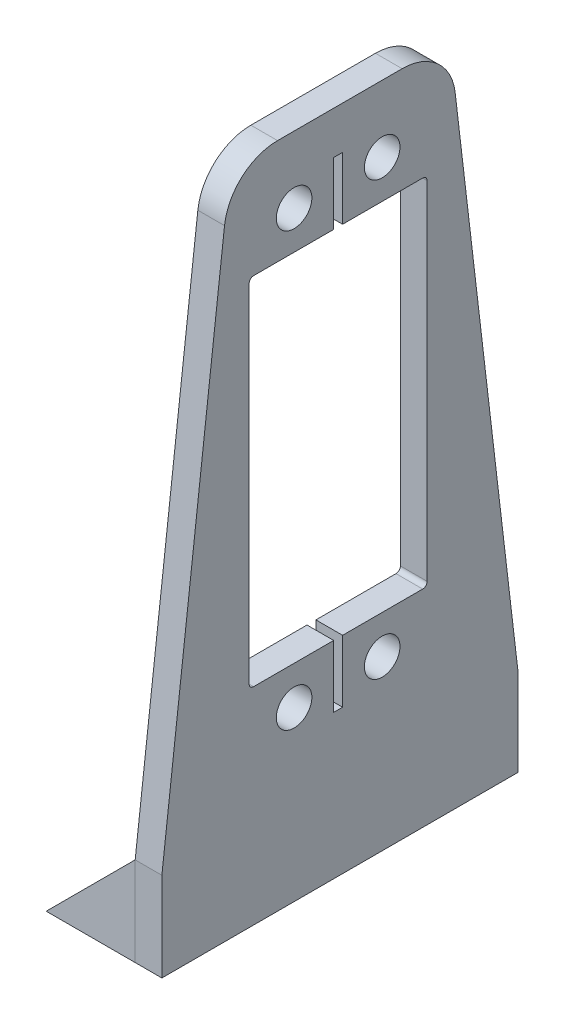
ISO-10303-21;
HEADER;
FILE_DESCRIPTION(('STEP AP214'),'2;1');
FILE_NAME('part.step','',(''),(''),'','','');
FILE_SCHEMA(('AUTOMOTIVE_DESIGN { 1 0 10303 214 1 1 1 1 }'));
ENDSEC;
DATA;
#1=APPLICATION_CONTEXT('core data for automotive mechanical design processes');
#2=APPLICATION_PROTOCOL_DEFINITION('international standard','automotive_design',2000,#1);
#3=PRODUCT_CONTEXT('',#1,'mechanical');
#4=PRODUCT('Part','Part','',(#3));
#5=PRODUCT_RELATED_PRODUCT_CATEGORY('part','',(#4));
#6=PRODUCT_DEFINITION_FORMATION('','',#4);
#7=PRODUCT_DEFINITION_CONTEXT('part definition',#1,'design');
#8=PRODUCT_DEFINITION('design','',#6,#7);
#9=PRODUCT_DEFINITION_SHAPE('','',#8);
#10=(LENGTH_UNIT() NAMED_UNIT(*) SI_UNIT(.MILLI.,.METRE.));
#11=(NAMED_UNIT(*) PLANE_ANGLE_UNIT() SI_UNIT($,.RADIAN.));
#12=(NAMED_UNIT(*) SI_UNIT($,.STERADIAN.) SOLID_ANGLE_UNIT());
#13=UNCERTAINTY_MEASURE_WITH_UNIT(LENGTH_MEASURE(1.E-05),#10,'distance_accuracy_value','');
#14=(GEOMETRIC_REPRESENTATION_CONTEXT(3) GLOBAL_UNCERTAINTY_ASSIGNED_CONTEXT((#13)) GLOBAL_UNIT_ASSIGNED_CONTEXT((#10,
#11,#12)) REPRESENTATION_CONTEXT('',''));
#15=CARTESIAN_POINT('',(0.,0.,0.));
#16=DIRECTION('',(0.,0.,1.));
#17=DIRECTION('',(1.,0.,0.));
#18=AXIS2_PLACEMENT_3D('',#15,#16,#17);
#19=CARTESIAN_POINT('',(23.,0.,-20.));
#20=DIRECTION('',(0.,1.,0.));
#21=DIRECTION('',(0.,0.,-1.));
#22=AXIS2_PLACEMENT_3D('',#19,#20,#21);
#23=PLANE('',#22);
#24=DIRECTION('',(0.,0.,1.));
#25=VECTOR('',#24,1.);
#26=CARTESIAN_POINT('',(20.,0.,-20.));
#27=LINE('',#26,#25);
#28=CARTESIAN_POINT('',(20.,0.,-20.));
#29=VERTEX_POINT('',#28);
#30=CARTESIAN_POINT('',(20.,0.,20.));
#31=VERTEX_POINT('',#30);
#32=EDGE_CURVE('E297',#29,#31,#27,.T.);
#33=ORIENTED_EDGE('',*,*,#32,.F.);
#34=DIRECTION('',(-1.,0.,0.));
#35=VECTOR('',#34,1.);
#36=CARTESIAN_POINT('',(23.,0.,-20.));
#37=LINE('',#36,#35);
#38=CARTESIAN_POINT('',(23.,0.,-20.));
#39=VERTEX_POINT('',#38);
#40=EDGE_CURVE('E322',#39,#29,#37,.T.);
#41=ORIENTED_EDGE('',*,*,#40,.F.);
#42=DIRECTION('',(0.,0.,1.));
#43=VECTOR('',#42,1.);
#44=CARTESIAN_POINT('',(23.,0.,-20.));
#45=LINE('',#44,#43);
#46=CARTESIAN_POINT('',(23.,0.,20.));
#47=VERTEX_POINT('',#46);
#48=EDGE_CURVE('E298',#39,#47,#45,.T.);
#49=ORIENTED_EDGE('',*,*,#48,.T.);
#50=DIRECTION('',(-1.,0.,0.));
#51=VECTOR('',#50,1.);
#52=CARTESIAN_POINT('',(23.,0.,20.));
#53=LINE('',#52,#51);
#54=EDGE_CURVE('E12',#47,#31,#53,.T.);
#55=ORIENTED_EDGE('',*,*,#54,.T.);
#56=EDGE_LOOP('',(#33,#41,#49,#55));
#57=FACE_BOUND('',#56,.T.);
#58=ADVANCED_FACE('F49',(#57),#23,.F.);
#59=CARTESIAN_POINT('',(23.,0.,20.));
#60=DIRECTION('',(0.,0.,-1.));
#61=DIRECTION('',(1.,0.,0.));
#62=AXIS2_PLACEMENT_3D('',#59,#60,#61);
#63=PLANE('',#62);
#64=DIRECTION('',(0.,1.,0.));
#65=VECTOR('',#64,1.);
#66=CARTESIAN_POINT('',(20.,0.,20.));
#67=LINE('',#66,#65);
#68=CARTESIAN_POINT('',(20.,10.,20.));
#69=VERTEX_POINT('',#68);
#70=EDGE_CURVE('E325',#31,#69,#67,.T.);
#71=ORIENTED_EDGE('',*,*,#70,.F.);
#72=ORIENTED_EDGE('',*,*,#54,.F.);
#73=DIRECTION('',(0.,1.,0.));
#74=VECTOR('',#73,1.);
#75=CARTESIAN_POINT('',(23.,0.,20.));
#76=LINE('',#75,#74);
#77=CARTESIAN_POINT('',(23.,10.,20.));
#78=VERTEX_POINT('',#77);
#79=EDGE_CURVE('E301',#47,#78,#76,.T.);
#80=ORIENTED_EDGE('',*,*,#79,.T.);
#81=DIRECTION('',(-1.,0.,0.));
#82=VECTOR('',#81,1.);
#83=CARTESIAN_POINT('',(23.,10.,20.));
#84=LINE('',#83,#82);
#85=EDGE_CURVE('E56',#78,#69,#84,.T.);
#86=ORIENTED_EDGE('',*,*,#85,.T.);
#87=EDGE_LOOP('',(#71,#72,#80,#86));
#88=FACE_BOUND('',#87,.T.);
#89=ADVANCED_FACE('F363',(#88),#63,.F.);
#90=CARTESIAN_POINT('',(23.,10.,20.));
#91=DIRECTION('',(0.,-0.117127450682147,-0.993116891557435));
#92=DIRECTION('',(0.,-0.993116891557435,0.117127450682147));
#93=AXIS2_PLACEMENT_3D('',#90,#91,#92);
#94=PLANE('',#93);
#95=DIRECTION('',(0.,0.993116891557435,-0.117127450682147));
#96=VECTOR('',#95,1.);
#97=CARTESIAN_POINT('',(20.,10.,20.));
#98=LINE('',#97,#96);
#99=CARTESIAN_POINT('',(20.,69.7027647040929,12.9587013493446));
#100=VERTEX_POINT('',#99);
#101=EDGE_CURVE('E328',#69,#100,#98,.T.);
#102=ORIENTED_EDGE('',*,*,#101,.F.);
#103=ORIENTED_EDGE('',*,*,#85,.F.);
#104=DIRECTION('',(0.,0.993116891557435,-0.117127450682147));
#105=VECTOR('',#104,1.);
#106=CARTESIAN_POINT('',(23.,10.,20.));
#107=LINE('',#106,#105);
#108=CARTESIAN_POINT('',(23.,69.7027647040929,12.9587013493446));
#109=VERTEX_POINT('',#108);
#110=EDGE_CURVE('E305',#78,#109,#107,.T.);
#111=ORIENTED_EDGE('',*,*,#110,.T.);
#112=DIRECTION('',(-1.,0.,0.));
#113=VECTOR('',#112,1.);
#114=CARTESIAN_POINT('',(23.,69.7027647040929,12.9587013493446));
#115=LINE('',#114,#113);
#116=EDGE_CURVE('E358',#109,#100,#115,.T.);
#117=ORIENTED_EDGE('',*,*,#116,.T.);
#118=EDGE_LOOP('',(#102,#103,#111,#117));
#119=FACE_BOUND('',#118,.T.);
#120=ADVANCED_FACE('F375',(#119),#94,.F.);
#121=CARTESIAN_POINT('',(23.,69.,7.));
#122=DIRECTION('',(-1.,0.,0.));
#123=DIRECTION('',(0.,0.,-1.));
#124=AXIS2_PLACEMENT_3D('',#121,#122,#123);
#125=CYLINDRICAL_SURFACE('',#124,6.);
#126=CARTESIAN_POINT('',(20.,69.,7.));
#127=DIRECTION('',(-1.,0.,0.));
#128=DIRECTION('',(0.,0.,1.));
#129=AXIS2_PLACEMENT_3D('',#126,#127,#128);
#130=CIRCLE('',#129,6.);
#131=CARTESIAN_POINT('',(20.,75.,7.));
#132=VERTEX_POINT('',#131);
#133=EDGE_CURVE('E331',#100,#132,#130,.T.);
#134=ORIENTED_EDGE('',*,*,#133,.F.);
#135=ORIENTED_EDGE('',*,*,#116,.F.);
#136=CARTESIAN_POINT('',(23.,69.,7.));
#137=DIRECTION('',(-1.,0.,0.));
#138=DIRECTION('',(0.,0.,1.));
#139=AXIS2_PLACEMENT_3D('',#136,#137,#138);
#140=CIRCLE('',#139,6.);
#141=CARTESIAN_POINT('',(23.,75.,7.));
#142=VERTEX_POINT('',#141);
#143=EDGE_CURVE('E308',#109,#142,#140,.T.);
#144=ORIENTED_EDGE('',*,*,#143,.T.);
#145=DIRECTION('',(-1.,0.,0.));
#146=VECTOR('',#145,1.);
#147=CARTESIAN_POINT('',(23.,75.,7.));
#148=LINE('',#147,#146);
#149=EDGE_CURVE('E355',#142,#132,#148,.T.);
#150=ORIENTED_EDGE('',*,*,#149,.T.);
#151=EDGE_LOOP('',(#134,#135,#144,#150));
#152=FACE_BOUND('',#151,.T.);
#153=ADVANCED_FACE('F377',(#152),#125,.T.);
#154=CARTESIAN_POINT('',(23.,75.,7.));
#155=DIRECTION('',(0.,-1.,0.));
#156=DIRECTION('',(0.,0.,1.));
#157=AXIS2_PLACEMENT_3D('',#154,#155,#156);
#158=PLANE('',#157);
#159=DIRECTION('',(0.,0.,-1.));
#160=VECTOR('',#159,1.);
#161=CARTESIAN_POINT('',(20.,75.,7.));
#162=LINE('',#161,#160);
#163=CARTESIAN_POINT('',(20.,75.,-7.));
#164=VERTEX_POINT('',#163);
#165=EDGE_CURVE('E334',#132,#164,#162,.T.);
#166=ORIENTED_EDGE('',*,*,#165,.F.);
#167=ORIENTED_EDGE('',*,*,#149,.F.);
#168=DIRECTION('',(0.,0.,-1.));
#169=VECTOR('',#168,1.);
#170=CARTESIAN_POINT('',(23.,75.,7.));
#171=LINE('',#170,#169);
#172=CARTESIAN_POINT('',(23.,75.,-7.));
#173=VERTEX_POINT('',#172);
#174=EDGE_CURVE('E311',#142,#173,#171,.T.);
#175=ORIENTED_EDGE('',*,*,#174,.T.);
#176=DIRECTION('',(-1.,0.,0.));
#177=VECTOR('',#176,1.);
#178=CARTESIAN_POINT('',(23.,75.,-7.));
#179=LINE('',#178,#177);
#180=EDGE_CURVE('E352',#173,#164,#179,.T.);
#181=ORIENTED_EDGE('',*,*,#180,.T.);
#182=EDGE_LOOP('',(#166,#167,#175,#181));
#183=FACE_BOUND('',#182,.T.);
#184=ADVANCED_FACE('F380',(#183),#158,.F.);
#185=CARTESIAN_POINT('',(23.,69.,-7.));
#186=DIRECTION('',(-1.,0.,0.));
#187=DIRECTION('',(0.,0.,-1.));
#188=AXIS2_PLACEMENT_3D('',#185,#186,#187);
#189=CYLINDRICAL_SURFACE('',#188,6.);
#190=CARTESIAN_POINT('',(20.,69.,-7.));
#191=DIRECTION('',(-1.,0.,0.));
#192=DIRECTION('',(0.,0.,-1.));
#193=AXIS2_PLACEMENT_3D('',#190,#191,#192);
#194=CIRCLE('',#193,6.);
#195=CARTESIAN_POINT('',(20.,69.7027647040929,-12.9587013493446));
#196=VERTEX_POINT('',#195);
#197=EDGE_CURVE('E337',#164,#196,#194,.T.);
#198=ORIENTED_EDGE('',*,*,#197,.F.);
#199=ORIENTED_EDGE('',*,*,#180,.F.);
#200=CARTESIAN_POINT('',(23.,69.,-7.));
#201=DIRECTION('',(-1.,0.,0.));
#202=DIRECTION('',(0.,0.,-1.));
#203=AXIS2_PLACEMENT_3D('',#200,#201,#202);
#204=CIRCLE('',#203,6.);
#205=CARTESIAN_POINT('',(23.,69.7027647040929,-12.9587013493446));
#206=VERTEX_POINT('',#205);
#207=EDGE_CURVE('E314',#173,#206,#204,.T.);
#208=ORIENTED_EDGE('',*,*,#207,.T.);
#209=DIRECTION('',(-1.,0.,0.));
#210=VECTOR('',#209,1.);
#211=CARTESIAN_POINT('',(23.,69.7027647040929,-12.9587013493446));
#212=LINE('',#211,#210);
#213=EDGE_CURVE('E349',#206,#196,#212,.T.);
#214=ORIENTED_EDGE('',*,*,#213,.T.);
#215=EDGE_LOOP('',(#198,#199,#208,#214));
#216=FACE_BOUND('',#215,.T.);
#217=ADVANCED_FACE('F383',(#216),#189,.T.);
#218=CARTESIAN_POINT('',(23.,10.,-20.));
#219=DIRECTION('',(0.,-0.117127450682147,0.993116891557435));
#220=DIRECTION('',(0.,0.993116891557435,0.117127450682147));
#221=AXIS2_PLACEMENT_3D('',#218,#219,#220);
#222=PLANE('',#221);
#223=DIRECTION('',(0.,-0.993116891557435,-0.117127450682147));
#224=VECTOR('',#223,1.);
#225=CARTESIAN_POINT('',(20.,10.,-20.));
#226=LINE('',#225,#224);
#227=CARTESIAN_POINT('',(20.,10.,-20.));
#228=VERTEX_POINT('',#227);
#229=EDGE_CURVE('E340',#196,#228,#226,.T.);
#230=ORIENTED_EDGE('',*,*,#229,.F.);
#231=ORIENTED_EDGE('',*,*,#213,.F.);
#232=DIRECTION('',(0.,-0.993116891557435,-0.117127450682147));
#233=VECTOR('',#232,1.);
#234=CARTESIAN_POINT('',(23.,10.,-20.));
#235=LINE('',#234,#233);
#236=CARTESIAN_POINT('',(23.,10.,-20.));
#237=VERTEX_POINT('',#236);
#238=EDGE_CURVE('E317',#206,#237,#235,.T.);
#239=ORIENTED_EDGE('',*,*,#238,.T.);
#240=DIRECTION('',(-1.,0.,0.));
#241=VECTOR('',#240,1.);
#242=CARTESIAN_POINT('',(23.,10.,-20.));
#243=LINE('',#242,#241);
#244=EDGE_CURVE('E346',#237,#228,#243,.T.);
#245=ORIENTED_EDGE('',*,*,#244,.T.);
#246=EDGE_LOOP('',(#230,#231,#239,#245));
#247=FACE_BOUND('',#246,.T.);
#248=ADVANCED_FACE('F386',(#247),#222,.F.);
#249=CARTESIAN_POINT('',(23.,10.,-20.));
#250=DIRECTION('',(0.,0.,1.));
#251=DIRECTION('',(-1.,0.,0.));
#252=AXIS2_PLACEMENT_3D('',#249,#250,#251);
#253=PLANE('',#252);
#254=DIRECTION('',(0.,-1.,0.));
#255=VECTOR('',#254,1.);
#256=CARTESIAN_POINT('',(20.,10.,-20.));
#257=LINE('',#256,#255);
#258=EDGE_CURVE('E302',#228,#29,#257,.T.);
#259=ORIENTED_EDGE('',*,*,#258,.F.);
#260=ORIENTED_EDGE('',*,*,#244,.F.);
#261=DIRECTION('',(0.,-1.,0.));
#262=VECTOR('',#261,1.);
#263=CARTESIAN_POINT('',(23.,10.,-20.));
#264=LINE('',#263,#262);
#265=EDGE_CURVE('E320',#237,#39,#264,.T.);
#266=ORIENTED_EDGE('',*,*,#265,.T.);
#267=ORIENTED_EDGE('',*,*,#40,.T.);
#268=EDGE_LOOP('',(#259,#260,#266,#267));
#269=FACE_BOUND('',#268,.T.);
#270=ADVANCED_FACE('F388',(#269),#253,.F.);
#271=CARTESIAN_POINT('',(23.,69.,7.));
#272=DIRECTION('',(1.,0.,0.));
#273=DIRECTION('',(0.,0.,1.));
#274=AXIS2_PLACEMENT_3D('',#271,#272,#273);
#275=PLANE('',#274);
#276=CARTESIAN_POINT('',(23.,67.5,-4.75849529097955));
#277=DIRECTION('',(-1.,0.,0.));
#278=DIRECTION('',(0.,0.,1.));
#279=AXIS2_PLACEMENT_3D('',#276,#277,#278);
#280=CIRCLE('',#279,2.);
#281=CARTESIAN_POINT('',(23.,67.5,-2.75849529097955));
#282=VERTEX_POINT('',#281);
#283=EDGE_CURVE('E283',#282,#282,#280,.T.);
#284=ORIENTED_EDGE('',*,*,#283,.T.);
#285=EDGE_LOOP('',(#284));
#286=FACE_BOUND('',#285,.T.);
#287=CARTESIAN_POINT('',(23.,18.9,5.14150470902062));
#288=DIRECTION('',(-1.,0.,0.));
#289=DIRECTION('',(0.,0.,1.));
#290=AXIS2_PLACEMENT_3D('',#287,#288,#289);
#291=CIRCLE('',#290,2.);
#292=CARTESIAN_POINT('',(23.,18.9,7.14150470902062));
#293=VERTEX_POINT('',#292);
#294=EDGE_CURVE('E284',#293,#293,#291,.T.);
#295=ORIENTED_EDGE('',*,*,#294,.T.);
#296=EDGE_LOOP('',(#295));
#297=FACE_BOUND('',#296,.T.);
#298=DIRECTION('',(0.,0.,1.));
#299=VECTOR('',#298,1.);
#300=CARTESIAN_POINT('',(23.,23.2,-9.05849529097939));
#301=LINE('',#300,#299);
#302=CARTESIAN_POINT('',(23.,23.2,-9.3084952909794));
#303=VERTEX_POINT('',#302);
#304=CARTESIAN_POINT('',(23.,23.2,-0.308495290979401));
#305=VERTEX_POINT('',#304);
#306=EDGE_CURVE('E214',#303,#305,#301,.T.);
#307=ORIENTED_EDGE('',*,*,#306,.T.);
#308=DIRECTION('',(0.,-1.,0.));
#309=VECTOR('',#308,1.);
#310=CARTESIAN_POINT('',(23.,23.2,-0.308495290979401));
#311=LINE('',#310,#309);
#312=CARTESIAN_POINT('',(23.,16.2,-0.308495290979377));
#313=VERTEX_POINT('',#312);
#314=EDGE_CURVE('E229',#305,#313,#311,.T.);
#315=ORIENTED_EDGE('',*,*,#314,.T.);
#316=DIRECTION('',(0.,0.,1.));
#317=VECTOR('',#316,1.);
#318=CARTESIAN_POINT('',(23.,16.2,-0.308495290979377));
#319=LINE('',#318,#317);
#320=CARTESIAN_POINT('',(23.,16.2,0.691504709020624));
#321=VERTEX_POINT('',#320);
#322=EDGE_CURVE('E798',#313,#321,#319,.T.);
#323=ORIENTED_EDGE('',*,*,#322,.T.);
#324=DIRECTION('',(0.,1.,0.));
#325=VECTOR('',#324,1.);
#326=CARTESIAN_POINT('',(23.,16.2,0.691504709020624));
#327=LINE('',#326,#325);
#328=CARTESIAN_POINT('',(23.,23.2,0.6915047090206));
#329=VERTEX_POINT('',#328);
#330=EDGE_CURVE('E795',#321,#329,#327,.T.);
#331=ORIENTED_EDGE('',*,*,#330,.T.);
#332=DIRECTION('',(0.,0.,1.));
#333=VECTOR('',#332,1.);
#334=CARTESIAN_POINT('',(23.,23.2,9.6915047090206));
#335=LINE('',#334,#333);
#336=CARTESIAN_POINT('',(23.,23.2,9.6915047090206));
#337=VERTEX_POINT('',#336);
#338=EDGE_CURVE('E792',#329,#337,#335,.T.);
#339=ORIENTED_EDGE('',*,*,#338,.T.);
#340=CARTESIAN_POINT('',(23.,23.7,9.6915047090206));
#341=DIRECTION('',(-1.,0.,0.));
#342=DIRECTION('',(0.,0.,1.));
#343=AXIS2_PLACEMENT_3D('',#340,#341,#342);
#344=CIRCLE('',#343,0.5);
#345=CARTESIAN_POINT('',(23.,23.7,10.1915047090206));
#346=VERTEX_POINT('',#345);
#347=EDGE_CURVE('E789',#337,#346,#344,.T.);
#348=ORIENTED_EDGE('',*,*,#347,.T.);
#349=DIRECTION('',(0.,1.,0.));
#350=VECTOR('',#349,1.);
#351=CARTESIAN_POINT('',(23.,62.7,10.1915047090205));
#352=LINE('',#351,#350);
#353=CARTESIAN_POINT('',(23.,62.7,10.1915047090205));
#354=VERTEX_POINT('',#353);
#355=EDGE_CURVE('E786',#346,#354,#352,.T.);
#356=ORIENTED_EDGE('',*,*,#355,.T.);
#357=CARTESIAN_POINT('',(23.,62.7,9.69150470902047));
#358=DIRECTION('',(-1.,0.,0.));
#359=DIRECTION('',(0.,0.,1.));
#360=AXIS2_PLACEMENT_3D('',#357,#358,#359);
#361=CIRCLE('',#360,0.500000000000001);
#362=CARTESIAN_POINT('',(23.,63.2,9.69150470902047));
#363=VERTEX_POINT('',#362);
#364=EDGE_CURVE('E783',#354,#363,#361,.T.);
#365=ORIENTED_EDGE('',*,*,#364,.T.);
#366=DIRECTION('',(0.,0.,-1.));
#367=VECTOR('',#366,1.);
#368=CARTESIAN_POINT('',(23.,63.2,0.691504709020468));
#369=LINE('',#368,#367);
#370=CARTESIAN_POINT('',(23.,63.2,0.691504709020468));
#371=VERTEX_POINT('',#370);
#372=EDGE_CURVE('E780',#363,#371,#369,.T.);
#373=ORIENTED_EDGE('',*,*,#372,.T.);
#374=DIRECTION('',(0.,1.,0.));
#375=VECTOR('',#374,1.);
#376=CARTESIAN_POINT('',(23.,63.2,0.691504709020468));
#377=LINE('',#376,#375);
#378=CARTESIAN_POINT('',(23.,70.2,0.691504709020444));
#379=VERTEX_POINT('',#378);
#380=EDGE_CURVE('E777',#371,#379,#377,.T.);
#381=ORIENTED_EDGE('',*,*,#380,.T.);
#382=DIRECTION('',(0.,0.,-1.));
#383=VECTOR('',#382,1.);
#384=CARTESIAN_POINT('',(23.,70.2,0.691504709020444));
#385=LINE('',#384,#383);
#386=CARTESIAN_POINT('',(23.,70.2,-0.308495290979557));
#387=VERTEX_POINT('',#386);
#388=EDGE_CURVE('E774',#379,#387,#385,.T.);
#389=ORIENTED_EDGE('',*,*,#388,.T.);
#390=DIRECTION('',(0.,-1.,0.));
#391=VECTOR('',#390,1.);
#392=CARTESIAN_POINT('',(23.,70.2,-0.308495290979557));
#393=LINE('',#392,#391);
#394=CARTESIAN_POINT('',(23.,63.2,-0.308495290979533));
#395=VERTEX_POINT('',#394);
#396=EDGE_CURVE('E771',#387,#395,#393,.T.);
#397=ORIENTED_EDGE('',*,*,#396,.T.);
#398=DIRECTION('',(0.,0.,-1.));
#399=VECTOR('',#398,1.);
#400=CARTESIAN_POINT('',(23.,63.2,-9.30849529097953));
#401=LINE('',#400,#399);
#402=CARTESIAN_POINT('',(23.,63.2,-9.30849529097953));
#403=VERTEX_POINT('',#402);
#404=EDGE_CURVE('E768',#395,#403,#401,.T.);
#405=ORIENTED_EDGE('',*,*,#404,.T.);
#406=CARTESIAN_POINT('',(23.,62.7,-9.30849529097953));
#407=DIRECTION('',(-1.,0.,0.));
#408=DIRECTION('',(0.,0.,1.));
#409=AXIS2_PLACEMENT_3D('',#406,#407,#408);
#410=CIRCLE('',#409,0.5);
#411=CARTESIAN_POINT('',(23.,62.7,-9.80849529097953));
#412=VERTEX_POINT('',#411);
#413=EDGE_CURVE('E765',#403,#412,#410,.T.);
#414=ORIENTED_EDGE('',*,*,#413,.T.);
#415=DIRECTION('',(0.,-1.,0.));
#416=VECTOR('',#415,1.);
#417=CARTESIAN_POINT('',(23.,23.7,-9.8084952909794));
#418=LINE('',#417,#416);
#419=CARTESIAN_POINT('',(23.,23.7,-9.8084952909794));
#420=VERTEX_POINT('',#419);
#421=EDGE_CURVE('E759',#412,#420,#418,.T.);
#422=ORIENTED_EDGE('',*,*,#421,.T.);
#423=CARTESIAN_POINT('',(23.,23.7,-9.3084952909794));
#424=DIRECTION('',(-1.,0.,0.));
#425=DIRECTION('',(0.,0.,1.));
#426=AXIS2_PLACEMENT_3D('',#423,#424,#425);
#427=CIRCLE('',#426,0.5);
#428=EDGE_CURVE('E757',#420,#303,#427,.T.);
#429=ORIENTED_EDGE('',*,*,#428,.T.);
#430=EDGE_LOOP('',(#307,#315,#323,#331,#339,#348,#356,#365,#373,#381,#389,#397,#405,#414,#422,#429));
#431=FACE_BOUND('',#430,.T.);
#432=CARTESIAN_POINT('',(23.,18.9,-4.75849529097937));
#433=DIRECTION('',(-1.,0.,0.));
#434=DIRECTION('',(0.,0.,1.));
#435=AXIS2_PLACEMENT_3D('',#432,#433,#434);
#436=CIRCLE('',#435,2.);
#437=CARTESIAN_POINT('',(23.,18.9,-2.75849529097938));
#438=VERTEX_POINT('',#437);
#439=EDGE_CURVE('E276',#438,#438,#436,.T.);
#440=ORIENTED_EDGE('',*,*,#439,.T.);
#441=EDGE_LOOP('',(#440));
#442=FACE_BOUND('',#441,.T.);
#443=CARTESIAN_POINT('',(23.,67.5,5.14150470902045));
#444=DIRECTION('',(-1.,0.,0.));
#445=DIRECTION('',(0.,0.,1.));
#446=AXIS2_PLACEMENT_3D('',#443,#444,#445);
#447=CIRCLE('',#446,2.);
#448=CARTESIAN_POINT('',(23.,67.5,7.14150470902045));
#449=VERTEX_POINT('',#448);
#450=EDGE_CURVE('E287',#449,#449,#447,.T.);
#451=ORIENTED_EDGE('',*,*,#450,.T.);
#452=EDGE_LOOP('',(#451));
#453=FACE_BOUND('',#452,.T.);
#454=ORIENTED_EDGE('',*,*,#48,.F.);
#455=ORIENTED_EDGE('',*,*,#265,.F.);
#456=ORIENTED_EDGE('',*,*,#238,.F.);
#457=ORIENTED_EDGE('',*,*,#207,.F.);
#458=ORIENTED_EDGE('',*,*,#174,.F.);
#459=ORIENTED_EDGE('',*,*,#143,.F.);
#460=ORIENTED_EDGE('',*,*,#110,.F.);
#461=ORIENTED_EDGE('',*,*,#79,.F.);
#462=EDGE_LOOP('',(#454,#455,#456,#457,#458,#459,#460,#461));
#463=FACE_BOUND('',#462,.T.);
#464=ADVANCED_FACE('F372',(#286,#297,#431,#442,#453,#463),#275,.T.);
#465=CARTESIAN_POINT('',(20.,69.,7.));
#466=DIRECTION('',(1.,0.,0.));
#467=DIRECTION('',(0.,0.,1.));
#468=AXIS2_PLACEMENT_3D('',#465,#466,#467);
#469=PLANE('',#468);
#470=CARTESIAN_POINT('',(20.,67.5,-4.75849529097955));
#471=DIRECTION('',(-1.,0.,0.));
#472=DIRECTION('',(0.,0.,1.));
#473=AXIS2_PLACEMENT_3D('',#470,#471,#472);
#474=CIRCLE('',#473,2.);
#475=CARTESIAN_POINT('',(20.,67.5,-2.75849529097955));
#476=VERTEX_POINT('',#475);
#477=EDGE_CURVE('E280',#476,#476,#474,.F.);
#478=ORIENTED_EDGE('',*,*,#477,.T.);
#479=EDGE_LOOP('',(#478));
#480=FACE_BOUND('',#479,.T.);
#481=CARTESIAN_POINT('',(20.,18.9,5.14150470902062));
#482=DIRECTION('',(-1.,0.,0.));
#483=DIRECTION('',(0.,0.,1.));
#484=AXIS2_PLACEMENT_3D('',#481,#482,#483);
#485=CIRCLE('',#484,2.);
#486=CARTESIAN_POINT('',(20.,18.9,7.14150470902062));
#487=VERTEX_POINT('',#486);
#488=EDGE_CURVE('E279',#487,#487,#485,.F.);
#489=ORIENTED_EDGE('',*,*,#488,.T.);
#490=EDGE_LOOP('',(#489));
#491=FACE_BOUND('',#490,.T.);
#492=CARTESIAN_POINT('',(20.,23.7,-9.3084952909794));
#493=DIRECTION('',(-1.,0.,0.));
#494=DIRECTION('',(0.,0.,1.));
#495=AXIS2_PLACEMENT_3D('',#492,#493,#494);
#496=CIRCLE('',#495,0.5);
#497=CARTESIAN_POINT('',(20.,23.2,-9.3084952909794));
#498=VERTEX_POINT('',#497);
#499=CARTESIAN_POINT('',(20.,23.7,-9.8084952909794));
#500=VERTEX_POINT('',#499);
#501=EDGE_CURVE('E227',#498,#500,#496,.F.);
#502=ORIENTED_EDGE('',*,*,#501,.T.);
#503=DIRECTION('',(0.,1.,0.));
#504=VECTOR('',#503,1.);
#505=CARTESIAN_POINT('',(20.,23.7,-9.8084952909794));
#506=LINE('',#505,#504);
#507=CARTESIAN_POINT('',(20.,62.7,-9.80849529097953));
#508=VERTEX_POINT('',#507);
#509=EDGE_CURVE('E233',#500,#508,#506,.T.);
#510=ORIENTED_EDGE('',*,*,#509,.T.);
#511=CARTESIAN_POINT('',(20.,62.7,-9.30849529097953));
#512=DIRECTION('',(-1.,0.,0.));
#513=DIRECTION('',(0.,0.,1.));
#514=AXIS2_PLACEMENT_3D('',#511,#512,#513);
#515=CIRCLE('',#514,0.5);
#516=CARTESIAN_POINT('',(20.,63.2,-9.30849529097953));
#517=VERTEX_POINT('',#516);
#518=EDGE_CURVE('E235',#508,#517,#515,.F.);
#519=ORIENTED_EDGE('',*,*,#518,.T.);
#520=DIRECTION('',(0.,0.,1.));
#521=VECTOR('',#520,1.);
#522=CARTESIAN_POINT('',(20.,63.2,-9.30849529097953));
#523=LINE('',#522,#521);
#524=CARTESIAN_POINT('',(20.,63.2,-0.308495290979533));
#525=VERTEX_POINT('',#524);
#526=EDGE_CURVE('E241',#517,#525,#523,.T.);
#527=ORIENTED_EDGE('',*,*,#526,.T.);
#528=DIRECTION('',(0.,1.,0.));
#529=VECTOR('',#528,1.);
#530=CARTESIAN_POINT('',(20.,70.2,-0.308495290979557));
#531=LINE('',#530,#529);
#532=CARTESIAN_POINT('',(20.,70.2,-0.308495290979557));
#533=VERTEX_POINT('',#532);
#534=EDGE_CURVE('E244',#525,#533,#531,.T.);
#535=ORIENTED_EDGE('',*,*,#534,.T.);
#536=DIRECTION('',(0.,0.,1.));
#537=VECTOR('',#536,1.);
#538=CARTESIAN_POINT('',(20.,70.2,0.691504709020444));
#539=LINE('',#538,#537);
#540=CARTESIAN_POINT('',(20.,70.2,0.691504709020444));
#541=VERTEX_POINT('',#540);
#542=EDGE_CURVE('E247',#533,#541,#539,.T.);
#543=ORIENTED_EDGE('',*,*,#542,.T.);
#544=DIRECTION('',(0.,-1.,0.));
#545=VECTOR('',#544,1.);
#546=CARTESIAN_POINT('',(20.,63.2,0.691504709020468));
#547=LINE('',#546,#545);
#548=CARTESIAN_POINT('',(20.,63.2,0.691504709020468));
#549=VERTEX_POINT('',#548);
#550=EDGE_CURVE('E250',#541,#549,#547,.T.);
#551=ORIENTED_EDGE('',*,*,#550,.T.);
#552=DIRECTION('',(0.,0.,1.));
#553=VECTOR('',#552,1.);
#554=CARTESIAN_POINT('',(20.,63.2,0.691504709020468));
#555=LINE('',#554,#553);
#556=CARTESIAN_POINT('',(20.,63.2,9.69150470902047));
#557=VERTEX_POINT('',#556);
#558=EDGE_CURVE('E253',#549,#557,#555,.T.);
#559=ORIENTED_EDGE('',*,*,#558,.T.);
#560=CARTESIAN_POINT('',(20.,62.7,9.69150470902047));
#561=DIRECTION('',(-1.,0.,0.));
#562=DIRECTION('',(0.,0.,1.));
#563=AXIS2_PLACEMENT_3D('',#560,#561,#562);
#564=CIRCLE('',#563,0.500000000000001);
#565=CARTESIAN_POINT('',(20.,62.7,10.1915047090205));
#566=VERTEX_POINT('',#565);
#567=EDGE_CURVE('E256',#557,#566,#564,.F.);
#568=ORIENTED_EDGE('',*,*,#567,.T.);
#569=DIRECTION('',(0.,-1.,0.));
#570=VECTOR('',#569,1.);
#571=CARTESIAN_POINT('',(20.,62.7,10.1915047090205));
#572=LINE('',#571,#570);
#573=CARTESIAN_POINT('',(20.,23.7,10.1915047090206));
#574=VERTEX_POINT('',#573);
#575=EDGE_CURVE('E259',#566,#574,#572,.T.);
#576=ORIENTED_EDGE('',*,*,#575,.T.);
#577=CARTESIAN_POINT('',(20.,23.7,9.6915047090206));
#578=DIRECTION('',(-1.,0.,0.));
#579=DIRECTION('',(0.,0.,1.));
#580=AXIS2_PLACEMENT_3D('',#577,#578,#579);
#581=CIRCLE('',#580,0.5);
#582=CARTESIAN_POINT('',(20.,23.2,9.6915047090206));
#583=VERTEX_POINT('',#582);
#584=EDGE_CURVE('E262',#574,#583,#581,.F.);
#585=ORIENTED_EDGE('',*,*,#584,.T.);
#586=DIRECTION('',(0.,0.,-1.));
#587=VECTOR('',#586,1.);
#588=CARTESIAN_POINT('',(20.,23.2,9.6915047090206));
#589=LINE('',#588,#587);
#590=CARTESIAN_POINT('',(20.,23.2,0.6915047090206));
#591=VERTEX_POINT('',#590);
#592=EDGE_CURVE('E265',#583,#591,#589,.T.);
#593=ORIENTED_EDGE('',*,*,#592,.T.);
#594=DIRECTION('',(0.,-1.,0.));
#595=VECTOR('',#594,1.);
#596=CARTESIAN_POINT('',(20.,16.2,0.691504709020624));
#597=LINE('',#596,#595);
#598=CARTESIAN_POINT('',(20.,16.2,0.691504709020624));
#599=VERTEX_POINT('',#598);
#600=EDGE_CURVE('E268',#591,#599,#597,.T.);
#601=ORIENTED_EDGE('',*,*,#600,.T.);
#602=DIRECTION('',(0.,0.,-1.));
#603=VECTOR('',#602,1.);
#604=CARTESIAN_POINT('',(20.,16.2,-0.308495290979377));
#605=LINE('',#604,#603);
#606=CARTESIAN_POINT('',(20.,16.2,-0.308495290979377));
#607=VERTEX_POINT('',#606);
#608=EDGE_CURVE('E271',#599,#607,#605,.T.);
#609=ORIENTED_EDGE('',*,*,#608,.T.);
#610=DIRECTION('',(0.,1.,0.));
#611=VECTOR('',#610,1.);
#612=CARTESIAN_POINT('',(20.,23.2,-0.308495290979401));
#613=LINE('',#612,#611);
#614=CARTESIAN_POINT('',(20.,23.2,-0.308495290979401));
#615=VERTEX_POINT('',#614);
#616=EDGE_CURVE('E220',#607,#615,#613,.T.);
#617=ORIENTED_EDGE('',*,*,#616,.T.);
#618=DIRECTION('',(0.,0.,-1.));
#619=VECTOR('',#618,1.);
#620=CARTESIAN_POINT('',(20.,23.2,-9.05849529097939));
#621=LINE('',#620,#619);
#622=EDGE_CURVE('E211',#615,#498,#621,.T.);
#623=ORIENTED_EDGE('',*,*,#622,.T.);
#624=EDGE_LOOP('',(#502,#510,#519,#527,#535,#543,#551,#559,#568,#576,#585,#593,#601,#609,#617,#623));
#625=FACE_BOUND('',#624,.T.);
#626=CARTESIAN_POINT('',(20.,18.9,-4.75849529097937));
#627=DIRECTION('',(-1.,0.,0.));
#628=DIRECTION('',(0.,0.,1.));
#629=AXIS2_PLACEMENT_3D('',#626,#627,#628);
#630=CIRCLE('',#629,2.);
#631=CARTESIAN_POINT('',(20.,18.9,-2.75849529097938));
#632=VERTEX_POINT('',#631);
#633=EDGE_CURVE('E273',#632,#632,#630,.F.);
#634=ORIENTED_EDGE('',*,*,#633,.T.);
#635=EDGE_LOOP('',(#634));
#636=FACE_BOUND('',#635,.T.);
#637=CARTESIAN_POINT('',(20.,67.5,5.14150470902045));
#638=DIRECTION('',(-1.,0.,0.));
#639=DIRECTION('',(0.,0.,1.));
#640=AXIS2_PLACEMENT_3D('',#637,#638,#639);
#641=CIRCLE('',#640,2.);
#642=CARTESIAN_POINT('',(20.,67.5,7.14150470902045));
#643=VERTEX_POINT('',#642);
#644=EDGE_CURVE('E294',#643,#643,#641,.F.);
#645=ORIENTED_EDGE('',*,*,#644,.T.);
#646=EDGE_LOOP('',(#645));
#647=FACE_BOUND('',#646,.T.);
#648=ORIENTED_EDGE('',*,*,#32,.T.);
#649=ORIENTED_EDGE('',*,*,#70,.T.);
#650=ORIENTED_EDGE('',*,*,#101,.T.);
#651=ORIENTED_EDGE('',*,*,#133,.T.);
#652=ORIENTED_EDGE('',*,*,#165,.T.);
#653=ORIENTED_EDGE('',*,*,#197,.T.);
#654=ORIENTED_EDGE('',*,*,#229,.T.);
#655=ORIENTED_EDGE('',*,*,#258,.T.);
#656=EDGE_LOOP('',(#648,#649,#650,#651,#652,#653,#654,#655));
#657=FACE_BOUND('',#656,.T.);
#658=ADVANCED_FACE('F224',(#480,#491,#625,#636,#647,#657),#469,.F.);
#659=CARTESIAN_POINT('',(9.9989999999999,67.5,5.14150470902045));
#660=DIRECTION('',(1.,0.,0.));
#661=DIRECTION('',(0.,0.,1.));
#662=AXIS2_PLACEMENT_3D('',#659,#660,#661);
#663=CYLINDRICAL_SURFACE('',#662,2.);
#664=ORIENTED_EDGE('',*,*,#450,.F.);
#665=EDGE_LOOP('',(#664));
#666=FACE_BOUND('',#665,.T.);
#667=ORIENTED_EDGE('',*,*,#644,.F.);
#668=EDGE_LOOP('',(#667));
#669=FACE_BOUND('',#668,.T.);
#670=ADVANCED_FACE('F443',(#666,#669),#663,.F.);
#671=CARTESIAN_POINT('',(9.9989999999999,18.9,-4.75849529097937));
#672=DIRECTION('',(1.,0.,0.));
#673=DIRECTION('',(0.,0.,1.));
#674=AXIS2_PLACEMENT_3D('',#671,#672,#673);
#675=CYLINDRICAL_SURFACE('',#674,2.);
#676=ORIENTED_EDGE('',*,*,#439,.F.);
#677=EDGE_LOOP('',(#676));
#678=FACE_BOUND('',#677,.T.);
#679=ORIENTED_EDGE('',*,*,#633,.F.);
#680=EDGE_LOOP('',(#679));
#681=FACE_BOUND('',#680,.T.);
#682=ADVANCED_FACE('F453',(#678,#681),#675,.F.);
#683=CARTESIAN_POINT('',(9.9989999999999,23.2,-9.05849529097939));
#684=DIRECTION('',(0.,-1.,0.));
#685=DIRECTION('',(0.,0.,1.));
#686=AXIS2_PLACEMENT_3D('',#683,#684,#685);
#687=PLANE('',#686);
#688=ORIENTED_EDGE('',*,*,#622,.F.);
#689=DIRECTION('',(1.,0.,0.));
#690=VECTOR('',#689,1.);
#691=CARTESIAN_POINT('',(9.9989999999999,23.2,-0.308495290979401));
#692=LINE('',#691,#690);
#693=EDGE_CURVE('E63',#615,#305,#692,.T.);
#694=ORIENTED_EDGE('',*,*,#693,.T.);
#695=ORIENTED_EDGE('',*,*,#306,.F.);
#696=DIRECTION('',(1.,0.,0.));
#697=VECTOR('',#696,1.);
#698=CARTESIAN_POINT('',(9.9989999999999,23.2,-9.3084952909794));
#699=LINE('',#698,#697);
#700=EDGE_CURVE('E208',#498,#303,#699,.T.);
#701=ORIENTED_EDGE('',*,*,#700,.F.);
#702=EDGE_LOOP('',(#688,#694,#695,#701));
#703=FACE_BOUND('',#702,.T.);
#704=ADVANCED_FACE('F210',(#703),#687,.F.);
#705=CARTESIAN_POINT('',(9.9989999999999,23.7,-9.3084952909794));
#706=DIRECTION('',(1.,0.,0.));
#707=DIRECTION('',(0.,0.,1.));
#708=AXIS2_PLACEMENT_3D('',#705,#706,#707);
#709=CYLINDRICAL_SURFACE('',#708,0.5);
#710=ORIENTED_EDGE('',*,*,#501,.F.);
#711=ORIENTED_EDGE('',*,*,#700,.T.);
#712=ORIENTED_EDGE('',*,*,#428,.F.);
#713=DIRECTION('',(1.,0.,0.));
#714=VECTOR('',#713,1.);
#715=CARTESIAN_POINT('',(9.9989999999999,23.7,-9.8084952909794));
#716=LINE('',#715,#714);
#717=EDGE_CURVE('E219',#500,#420,#716,.T.);
#718=ORIENTED_EDGE('',*,*,#717,.F.);
#719=EDGE_LOOP('',(#710,#711,#712,#718));
#720=FACE_BOUND('',#719,.T.);
#721=ADVANCED_FACE('F231',(#720),#709,.F.);
#722=CARTESIAN_POINT('',(9.9989999999999,23.7,-9.8084952909794));
#723=DIRECTION('',(0.,0.,-1.));
#724=DIRECTION('',(0.,-1.,0.));
#725=AXIS2_PLACEMENT_3D('',#722,#723,#724);
#726=PLANE('',#725);
#727=ORIENTED_EDGE('',*,*,#509,.F.);
#728=ORIENTED_EDGE('',*,*,#717,.T.);
#729=ORIENTED_EDGE('',*,*,#421,.F.);
#730=DIRECTION('',(1.,0.,0.));
#731=VECTOR('',#730,1.);
#732=CARTESIAN_POINT('',(9.9989999999999,62.7,-9.80849529097953));
#733=LINE('',#732,#731);
#734=EDGE_CURVE('E839',#508,#412,#733,.T.);
#735=ORIENTED_EDGE('',*,*,#734,.F.);
#736=EDGE_LOOP('',(#727,#728,#729,#735));
#737=FACE_BOUND('',#736,.T.);
#738=ADVANCED_FACE('F483',(#737),#726,.F.);
#739=CARTESIAN_POINT('',(9.9989999999999,62.7,-9.30849529097953));
#740=DIRECTION('',(1.,0.,0.));
#741=DIRECTION('',(0.,0.,1.));
#742=AXIS2_PLACEMENT_3D('',#739,#740,#741);
#743=CYLINDRICAL_SURFACE('',#742,0.5);
#744=ORIENTED_EDGE('',*,*,#518,.F.);
#745=ORIENTED_EDGE('',*,*,#734,.T.);
#746=ORIENTED_EDGE('',*,*,#413,.F.);
#747=DIRECTION('',(1.,0.,0.));
#748=VECTOR('',#747,1.);
#749=CARTESIAN_POINT('',(9.9989999999999,63.2,-9.30849529097953));
#750=LINE('',#749,#748);
#751=EDGE_CURVE('E835',#517,#403,#750,.T.);
#752=ORIENTED_EDGE('',*,*,#751,.F.);
#753=EDGE_LOOP('',(#744,#745,#746,#752));
#754=FACE_BOUND('',#753,.T.);
#755=ADVANCED_FACE('F493',(#754),#743,.F.);
#756=CARTESIAN_POINT('',(9.9989999999999,63.2,-9.30849529097953));
#757=DIRECTION('',(0.,1.,0.));
#758=DIRECTION('',(0.,0.,-1.));
#759=AXIS2_PLACEMENT_3D('',#756,#757,#758);
#760=PLANE('',#759);
#761=ORIENTED_EDGE('',*,*,#526,.F.);
#762=ORIENTED_EDGE('',*,*,#751,.T.);
#763=ORIENTED_EDGE('',*,*,#404,.F.);
#764=DIRECTION('',(1.,0.,0.));
#765=VECTOR('',#764,1.);
#766=CARTESIAN_POINT('',(9.9989999999999,63.2,-0.308495290979533));
#767=LINE('',#766,#765);
#768=EDGE_CURVE('E833',#525,#395,#767,.T.);
#769=ORIENTED_EDGE('',*,*,#768,.F.);
#770=EDGE_LOOP('',(#761,#762,#763,#769));
#771=FACE_BOUND('',#770,.T.);
#772=ADVANCED_FACE('F504',(#771),#760,.F.);
#773=CARTESIAN_POINT('',(9.9989999999999,70.2,-0.308495290979557));
#774=DIRECTION('',(0.,0.,-1.));
#775=DIRECTION('',(0.,-1.,0.));
#776=AXIS2_PLACEMENT_3D('',#773,#774,#775);
#777=PLANE('',#776);
#778=ORIENTED_EDGE('',*,*,#534,.F.);
#779=ORIENTED_EDGE('',*,*,#768,.T.);
#780=ORIENTED_EDGE('',*,*,#396,.F.);
#781=DIRECTION('',(1.,0.,0.));
#782=VECTOR('',#781,1.);
#783=CARTESIAN_POINT('',(9.9989999999999,70.2,-0.308495290979557));
#784=LINE('',#783,#782);
#785=EDGE_CURVE('E828',#533,#387,#784,.T.);
#786=ORIENTED_EDGE('',*,*,#785,.F.);
#787=EDGE_LOOP('',(#778,#779,#780,#786));
#788=FACE_BOUND('',#787,.T.);
#789=ADVANCED_FACE('F516',(#788),#777,.F.);
#790=CARTESIAN_POINT('',(9.9989999999999,70.2,0.691504709020444));
#791=DIRECTION('',(0.,1.,0.));
#792=DIRECTION('',(0.,0.,-1.));
#793=AXIS2_PLACEMENT_3D('',#790,#791,#792);
#794=PLANE('',#793);
#795=ORIENTED_EDGE('',*,*,#542,.F.);
#796=ORIENTED_EDGE('',*,*,#785,.T.);
#797=ORIENTED_EDGE('',*,*,#388,.F.);
#798=DIRECTION('',(1.,0.,0.));
#799=VECTOR('',#798,1.);
#800=CARTESIAN_POINT('',(9.9989999999999,70.2,0.691504709020444));
#801=LINE('',#800,#799);
#802=EDGE_CURVE('E824',#541,#379,#801,.T.);
#803=ORIENTED_EDGE('',*,*,#802,.F.);
#804=EDGE_LOOP('',(#795,#796,#797,#803));
#805=FACE_BOUND('',#804,.T.);
#806=ADVANCED_FACE('F526',(#805),#794,.F.);
#807=CARTESIAN_POINT('',(9.9989999999999,63.2,0.691504709020468));
#808=DIRECTION('',(0.,0.,1.));
#809=DIRECTION('',(0.,1.,0.));
#810=AXIS2_PLACEMENT_3D('',#807,#808,#809);
#811=PLANE('',#810);
#812=ORIENTED_EDGE('',*,*,#550,.F.);
#813=ORIENTED_EDGE('',*,*,#802,.T.);
#814=ORIENTED_EDGE('',*,*,#380,.F.);
#815=DIRECTION('',(1.,0.,0.));
#816=VECTOR('',#815,1.);
#817=CARTESIAN_POINT('',(9.9989999999999,63.2,0.691504709020468));
#818=LINE('',#817,#816);
#819=EDGE_CURVE('E822',#549,#371,#818,.T.);
#820=ORIENTED_EDGE('',*,*,#819,.F.);
#821=EDGE_LOOP('',(#812,#813,#814,#820));
#822=FACE_BOUND('',#821,.T.);
#823=ADVANCED_FACE('F537',(#822),#811,.F.);
#824=CARTESIAN_POINT('',(9.9989999999999,63.2,0.691504709020468));
#825=DIRECTION('',(0.,1.,0.));
#826=DIRECTION('',(0.,0.,-1.));
#827=AXIS2_PLACEMENT_3D('',#824,#825,#826);
#828=PLANE('',#827);
#829=ORIENTED_EDGE('',*,*,#558,.F.);
#830=ORIENTED_EDGE('',*,*,#819,.T.);
#831=ORIENTED_EDGE('',*,*,#372,.F.);
#832=DIRECTION('',(1.,0.,0.));
#833=VECTOR('',#832,1.);
#834=CARTESIAN_POINT('',(9.9989999999999,63.2,9.69150470902047));
#835=LINE('',#834,#833);
#836=EDGE_CURVE('E817',#557,#363,#835,.T.);
#837=ORIENTED_EDGE('',*,*,#836,.F.);
#838=EDGE_LOOP('',(#829,#830,#831,#837));
#839=FACE_BOUND('',#838,.T.);
#840=ADVANCED_FACE('F548',(#839),#828,.F.);
#841=CARTESIAN_POINT('',(9.9989999999999,62.7,9.69150470902047));
#842=DIRECTION('',(1.,0.,0.));
#843=DIRECTION('',(0.,0.,1.));
#844=AXIS2_PLACEMENT_3D('',#841,#842,#843);
#845=CYLINDRICAL_SURFACE('',#844,0.500000000000001);
#846=ORIENTED_EDGE('',*,*,#567,.F.);
#847=ORIENTED_EDGE('',*,*,#836,.T.);
#848=ORIENTED_EDGE('',*,*,#364,.F.);
#849=DIRECTION('',(1.,0.,0.));
#850=VECTOR('',#849,1.);
#851=CARTESIAN_POINT('',(9.9989999999999,62.7,10.1915047090205));
#852=LINE('',#851,#850);
#853=EDGE_CURVE('E813',#566,#354,#852,.T.);
#854=ORIENTED_EDGE('',*,*,#853,.F.);
#855=EDGE_LOOP('',(#846,#847,#848,#854));
#856=FACE_BOUND('',#855,.T.);
#857=ADVANCED_FACE('F560',(#856),#845,.F.);
#858=CARTESIAN_POINT('',(9.9989999999999,62.7,10.1915047090205));
#859=DIRECTION('',(0.,0.,1.));
#860=DIRECTION('',(0.,1.,0.));
#861=AXIS2_PLACEMENT_3D('',#858,#859,#860);
#862=PLANE('',#861);
#863=ORIENTED_EDGE('',*,*,#575,.F.);
#864=ORIENTED_EDGE('',*,*,#853,.T.);
#865=ORIENTED_EDGE('',*,*,#355,.F.);
#866=DIRECTION('',(1.,0.,0.));
#867=VECTOR('',#866,1.);
#868=CARTESIAN_POINT('',(9.9989999999999,23.7,10.1915047090206));
#869=LINE('',#868,#867);
#870=EDGE_CURVE('E811',#574,#346,#869,.T.);
#871=ORIENTED_EDGE('',*,*,#870,.F.);
#872=EDGE_LOOP('',(#863,#864,#865,#871));
#873=FACE_BOUND('',#872,.T.);
#874=ADVANCED_FACE('F570',(#873),#862,.F.);
#875=CARTESIAN_POINT('',(9.9989999999999,23.7,9.6915047090206));
#876=DIRECTION('',(1.,0.,0.));
#877=DIRECTION('',(0.,0.,1.));
#878=AXIS2_PLACEMENT_3D('',#875,#876,#877);
#879=CYLINDRICAL_SURFACE('',#878,0.5);
#880=ORIENTED_EDGE('',*,*,#584,.F.);
#881=ORIENTED_EDGE('',*,*,#870,.T.);
#882=ORIENTED_EDGE('',*,*,#347,.F.);
#883=DIRECTION('',(1.,0.,0.));
#884=VECTOR('',#883,1.);
#885=CARTESIAN_POINT('',(9.9989999999999,23.2,9.6915047090206));
#886=LINE('',#885,#884);
#887=EDGE_CURVE('E806',#583,#337,#886,.T.);
#888=ORIENTED_EDGE('',*,*,#887,.F.);
#889=EDGE_LOOP('',(#880,#881,#882,#888));
#890=FACE_BOUND('',#889,.T.);
#891=ADVANCED_FACE('F581',(#890),#879,.F.);
#892=CARTESIAN_POINT('',(9.9989999999999,23.2,9.6915047090206));
#893=DIRECTION('',(0.,-1.,0.));
#894=DIRECTION('',(0.,0.,1.));
#895=AXIS2_PLACEMENT_3D('',#892,#893,#894);
#896=PLANE('',#895);
#897=ORIENTED_EDGE('',*,*,#592,.F.);
#898=ORIENTED_EDGE('',*,*,#887,.T.);
#899=ORIENTED_EDGE('',*,*,#338,.F.);
#900=DIRECTION('',(1.,0.,0.));
#901=VECTOR('',#900,1.);
#902=CARTESIAN_POINT('',(9.9989999999999,23.2,0.6915047090206));
#903=LINE('',#902,#901);
#904=EDGE_CURVE('E802',#591,#329,#903,.T.);
#905=ORIENTED_EDGE('',*,*,#904,.F.);
#906=EDGE_LOOP('',(#897,#898,#899,#905));
#907=FACE_BOUND('',#906,.T.);
#908=ADVANCED_FACE('F592',(#907),#896,.F.);
#909=CARTESIAN_POINT('',(9.9989999999999,16.2,0.691504709020624));
#910=DIRECTION('',(0.,0.,1.));
#911=DIRECTION('',(0.,1.,0.));
#912=AXIS2_PLACEMENT_3D('',#909,#910,#911);
#913=PLANE('',#912);
#914=ORIENTED_EDGE('',*,*,#600,.F.);
#915=ORIENTED_EDGE('',*,*,#904,.T.);
#916=ORIENTED_EDGE('',*,*,#330,.F.);
#917=DIRECTION('',(1.,0.,0.));
#918=VECTOR('',#917,1.);
#919=CARTESIAN_POINT('',(9.9989999999999,16.2,0.691504709020624));
#920=LINE('',#919,#918);
#921=EDGE_CURVE('E800',#599,#321,#920,.T.);
#922=ORIENTED_EDGE('',*,*,#921,.F.);
#923=EDGE_LOOP('',(#914,#915,#916,#922));
#924=FACE_BOUND('',#923,.T.);
#925=ADVANCED_FACE('F604',(#924),#913,.F.);
#926=CARTESIAN_POINT('',(9.9989999999999,16.2,-0.308495290979377));
#927=DIRECTION('',(0.,-1.,0.));
#928=DIRECTION('',(0.,0.,1.));
#929=AXIS2_PLACEMENT_3D('',#926,#927,#928);
#930=PLANE('',#929);
#931=ORIENTED_EDGE('',*,*,#608,.F.);
#932=ORIENTED_EDGE('',*,*,#921,.T.);
#933=ORIENTED_EDGE('',*,*,#322,.F.);
#934=DIRECTION('',(1.,0.,0.));
#935=VECTOR('',#934,1.);
#936=CARTESIAN_POINT('',(9.9989999999999,16.2,-0.308495290979377));
#937=LINE('',#936,#935);
#938=EDGE_CURVE('E71',#607,#313,#937,.T.);
#939=ORIENTED_EDGE('',*,*,#938,.F.);
#940=EDGE_LOOP('',(#931,#932,#933,#939));
#941=FACE_BOUND('',#940,.T.);
#942=ADVANCED_FACE('F614',(#941),#930,.F.);
#943=CARTESIAN_POINT('',(9.9989999999999,23.2,-0.308495290979401));
#944=DIRECTION('',(0.,0.,-1.));
#945=DIRECTION('',(0.,-1.,0.));
#946=AXIS2_PLACEMENT_3D('',#943,#944,#945);
#947=PLANE('',#946);
#948=ORIENTED_EDGE('',*,*,#616,.F.);
#949=ORIENTED_EDGE('',*,*,#938,.T.);
#950=ORIENTED_EDGE('',*,*,#314,.F.);
#951=ORIENTED_EDGE('',*,*,#693,.F.);
#952=EDGE_LOOP('',(#948,#949,#950,#951));
#953=FACE_BOUND('',#952,.T.);
#954=ADVANCED_FACE('F625',(#953),#947,.F.);
#955=CARTESIAN_POINT('',(9.9989999999999,18.9,5.14150470902062));
#956=DIRECTION('',(1.,0.,0.));
#957=DIRECTION('',(0.,0.,1.));
#958=AXIS2_PLACEMENT_3D('',#955,#956,#957);
#959=CYLINDRICAL_SURFACE('',#958,2.);
#960=ORIENTED_EDGE('',*,*,#294,.F.);
#961=EDGE_LOOP('',(#960));
#962=FACE_BOUND('',#961,.T.);
#963=ORIENTED_EDGE('',*,*,#488,.F.);
#964=EDGE_LOOP('',(#963));
#965=FACE_BOUND('',#964,.T.);
#966=ADVANCED_FACE('F635',(#962,#965),#959,.F.);
#967=CARTESIAN_POINT('',(9.9989999999999,67.5,-4.75849529097955));
#968=DIRECTION('',(1.,0.,0.));
#969=DIRECTION('',(0.,0.,1.));
#970=AXIS2_PLACEMENT_3D('',#967,#968,#969);
#971=CYLINDRICAL_SURFACE('',#970,2.);
#972=ORIENTED_EDGE('',*,*,#283,.F.);
#973=EDGE_LOOP('',(#972));
#974=FACE_BOUND('',#973,.T.);
#975=ORIENTED_EDGE('',*,*,#477,.F.);
#976=EDGE_LOOP('',(#975));
#977=FACE_BOUND('',#976,.T.);
#978=ADVANCED_FACE('F646',(#974,#977),#971,.F.);
#979=CLOSED_SHELL('',(#58,#89,#120,#153,#184,#217,#248,#270,#464,#658,#670,#682,#704,#721,#738,
#755,#772,#789,#806,#823,#840,#857,#874,#891,#908,#925,#942,#954,#966,#978));
#980=MANIFOLD_SOLID_BREP('B2',#979);
#981=CARTESIAN_POINT('',(9.9999999999999,0.,-20.));
#982=DIRECTION('',(0.,1.,0.));
#983=DIRECTION('',(0.,0.,-1.));
#984=AXIS2_PLACEMENT_3D('',#981,#982,#983);
#985=PLANE('',#984);
#986=DIRECTION('',(1.,0.,0.));
#987=VECTOR('',#986,1.);
#988=CARTESIAN_POINT('',(9.9999999999999,0.,20.));
#989=LINE('',#988,#987);
#990=CARTESIAN_POINT('',(9.9999999999999,0.,20.));
#991=VERTEX_POINT('',#990);
#992=CARTESIAN_POINT('',(20.,0.,20.));
#993=VERTEX_POINT('',#992);
#994=EDGE_CURVE('E903',#991,#993,#989,.T.);
#995=ORIENTED_EDGE('',*,*,#994,.F.);
#996=DIRECTION('',(0.,0.,1.));
#997=VECTOR('',#996,1.);
#998=CARTESIAN_POINT('',(9.9999999999999,0.,-20.));
#999=LINE('',#998,#997);
#1000=CARTESIAN_POINT('',(9.9999999999999,0.,-20.));
#1001=VERTEX_POINT('',#1000);
#1002=EDGE_CURVE('E898',#1001,#991,#999,.T.);
#1003=ORIENTED_EDGE('',*,*,#1002,.F.);
#1004=DIRECTION('',(1.,0.,0.));
#1005=VECTOR('',#1004,1.);
#1006=CARTESIAN_POINT('',(9.9999999999999,0.,-20.));
#1007=LINE('',#1006,#1005);
#1008=CARTESIAN_POINT('',(20.,0.,-20.));
#1009=VERTEX_POINT('',#1008);
#1010=EDGE_CURVE('E890',#1001,#1009,#1007,.T.);
#1011=ORIENTED_EDGE('',*,*,#1010,.T.);
#1012=DIRECTION('',(0.,0.,1.));
#1013=VECTOR('',#1012,1.);
#1014=CARTESIAN_POINT('',(20.,0.,-20.));
#1015=LINE('',#1014,#1013);
#1016=EDGE_CURVE('E47',#1009,#993,#1015,.T.);
#1017=ORIENTED_EDGE('',*,*,#1016,.T.);
#1018=EDGE_LOOP('',(#995,#1003,#1011,#1017));
#1019=FACE_BOUND('',#1018,.T.);
#1020=ADVANCED_FACE('F851',(#1019),#985,.F.);
#1021=CARTESIAN_POINT('',(20.,0.,-20.));
#1022=DIRECTION('',(-1.,0.,0.));
#1023=DIRECTION('',(0.,0.,-1.));
#1024=AXIS2_PLACEMENT_3D('',#1021,#1022,#1023);
#1025=PLANE('',#1024);
#1026=DIRECTION('',(0.,1.,0.));
#1027=VECTOR('',#1026,1.);
#1028=CARTESIAN_POINT('',(20.,0.,20.));
#1029=LINE('',#1028,#1027);
#1030=CARTESIAN_POINT('',(20.,10.,20.));
#1031=VERTEX_POINT('',#1030);
#1032=EDGE_CURVE('E895',#993,#1031,#1029,.T.);
#1033=ORIENTED_EDGE('',*,*,#1032,.F.);
#1034=ORIENTED_EDGE('',*,*,#1016,.F.);
#1035=DIRECTION('',(0.,1.,0.));
#1036=VECTOR('',#1035,1.);
#1037=CARTESIAN_POINT('',(20.,0.,-20.));
#1038=LINE('',#1037,#1036);
#1039=CARTESIAN_POINT('',(20.,10.,-20.));
#1040=VERTEX_POINT('',#1039);
#1041=EDGE_CURVE('E886',#1009,#1040,#1038,.T.);
#1042=ORIENTED_EDGE('',*,*,#1041,.T.);
#1043=DIRECTION('',(0.,0.,1.));
#1044=VECTOR('',#1043,1.);
#1045=CARTESIAN_POINT('',(20.,10.,-20.));
#1046=LINE('',#1045,#1044);
#1047=EDGE_CURVE('E859',#1040,#1031,#1046,.T.);
#1048=ORIENTED_EDGE('',*,*,#1047,.T.);
#1049=EDGE_LOOP('',(#1033,#1034,#1042,#1048));
#1050=FACE_BOUND('',#1049,.T.);
#1051=ADVANCED_FACE('F894',(#1050),#1025,.F.);
#1052=CARTESIAN_POINT('',(20.,10.,-20.));
#1053=DIRECTION('',(0.707106781186544,-0.707106781186551,0.));
#1054=DIRECTION('',(0.707106781186551,0.707106781186544,0.));
#1055=AXIS2_PLACEMENT_3D('',#1052,#1053,#1054);
#1056=PLANE('',#1055);
#1057=DIRECTION('',(-0.707106781186551,-0.707106781186544,0.));
#1058=VECTOR('',#1057,1.);
#1059=CARTESIAN_POINT('',(20.,10.,20.));
#1060=LINE('',#1059,#1058);
#1061=EDGE_CURVE('E878',#1031,#991,#1060,.T.);
#1062=ORIENTED_EDGE('',*,*,#1061,.F.);
#1063=ORIENTED_EDGE('',*,*,#1047,.F.);
#1064=DIRECTION('',(-0.707106781186551,-0.707106781186544,0.));
#1065=VECTOR('',#1064,1.);
#1066=CARTESIAN_POINT('',(20.,10.,-20.));
#1067=LINE('',#1066,#1065);
#1068=EDGE_CURVE('E867',#1040,#1001,#1067,.T.);
#1069=ORIENTED_EDGE('',*,*,#1068,.T.);
#1070=ORIENTED_EDGE('',*,*,#1002,.T.);
#1071=EDGE_LOOP('',(#1062,#1063,#1069,#1070));
#1072=FACE_BOUND('',#1071,.T.);
#1073=ADVANCED_FACE('F912',(#1072),#1056,.F.);
#1074=CARTESIAN_POINT('',(0.,0.,-20.));
#1075=DIRECTION('',(0.,0.,-1.));
#1076=DIRECTION('',(1.,0.,0.));
#1077=AXIS2_PLACEMENT_3D('',#1074,#1075,#1076);
#1078=PLANE('',#1077);
#1079=ORIENTED_EDGE('',*,*,#1010,.F.);
#1080=ORIENTED_EDGE('',*,*,#1068,.F.);
#1081=ORIENTED_EDGE('',*,*,#1041,.F.);
#1082=EDGE_LOOP('',(#1079,#1080,#1081));
#1083=FACE_BOUND('',#1082,.T.);
#1084=ADVANCED_FACE('F888',(#1083),#1078,.T.);
#1085=CARTESIAN_POINT('',(0.,0.,20.));
#1086=DIRECTION('',(0.,0.,-1.));
#1087=DIRECTION('',(1.,0.,0.));
#1088=AXIS2_PLACEMENT_3D('',#1085,#1086,#1087);
#1089=PLANE('',#1088);
#1090=ORIENTED_EDGE('',*,*,#994,.T.);
#1091=ORIENTED_EDGE('',*,*,#1032,.T.);
#1092=ORIENTED_EDGE('',*,*,#1061,.T.);
#1093=EDGE_LOOP('',(#1090,#1091,#1092));
#1094=FACE_BOUND('',#1093,.T.);
#1095=ADVANCED_FACE('F906',(#1094),#1089,.F.);
#1096=CLOSED_SHELL('',(#1020,#1051,#1073,#1084,#1095));
#1097=MANIFOLD_SOLID_BREP('B6',#1096);
#1098=ADVANCED_BREP_SHAPE_REPRESENTATION('',(#18,#980,#1097),#14);
#1099=SHAPE_DEFINITION_REPRESENTATION(#9,#1098);
ENDSEC;
END-ISO-10303-21;
